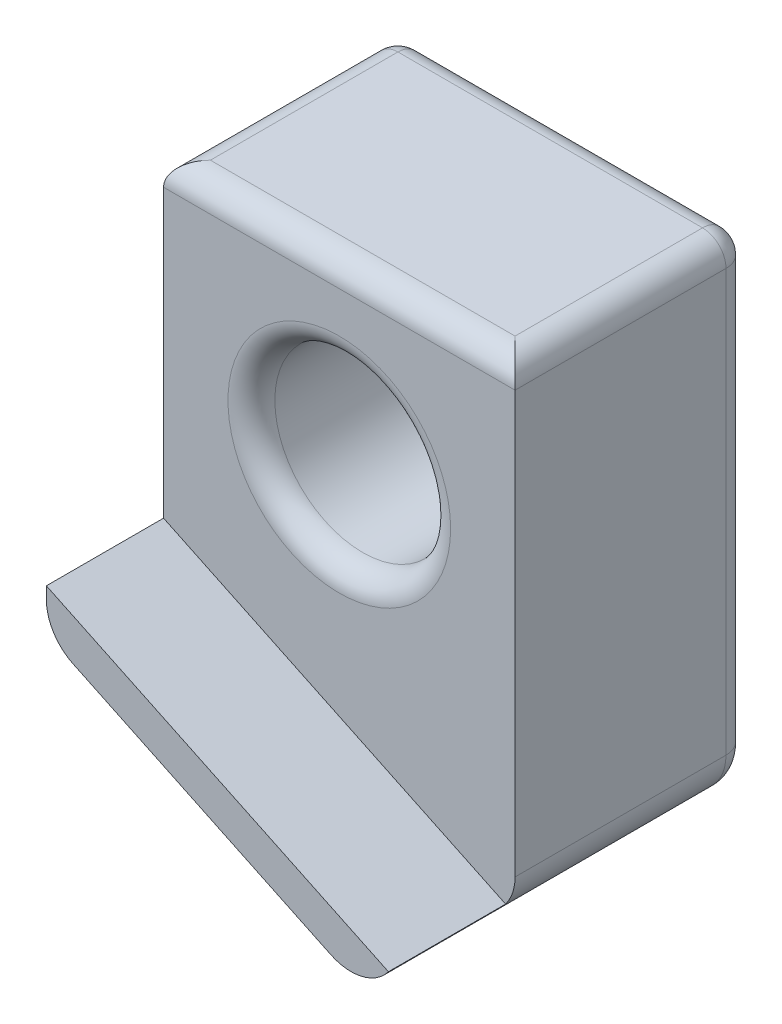
ISO-10303-21;
HEADER;
FILE_DESCRIPTION(('STEP AP214'),'2;1');
FILE_NAME('part.step','',(''),(''),'','','');
FILE_SCHEMA(('AUTOMOTIVE_DESIGN { 1 0 10303 214 1 1 1 1 }'));
ENDSEC;
DATA;
#1=APPLICATION_CONTEXT('core data for automotive mechanical design processes');
#2=APPLICATION_PROTOCOL_DEFINITION('international standard','automotive_design',2000,#1);
#3=PRODUCT_CONTEXT('',#1,'mechanical');
#4=PRODUCT('Part','Part','',(#3));
#5=PRODUCT_RELATED_PRODUCT_CATEGORY('part','',(#4));
#6=PRODUCT_DEFINITION_FORMATION('','',#4);
#7=PRODUCT_DEFINITION_CONTEXT('part definition',#1,'design');
#8=PRODUCT_DEFINITION('design','',#6,#7);
#9=PRODUCT_DEFINITION_SHAPE('','',#8);
#10=(LENGTH_UNIT() NAMED_UNIT(*) SI_UNIT(.MILLI.,.METRE.));
#11=(NAMED_UNIT(*) PLANE_ANGLE_UNIT() SI_UNIT($,.RADIAN.));
#12=(NAMED_UNIT(*) SI_UNIT($,.STERADIAN.) SOLID_ANGLE_UNIT());
#13=UNCERTAINTY_MEASURE_WITH_UNIT(LENGTH_MEASURE(1.E-05),#10,'distance_accuracy_value','');
#14=(GEOMETRIC_REPRESENTATION_CONTEXT(3) GLOBAL_UNCERTAINTY_ASSIGNED_CONTEXT((#13)) GLOBAL_UNIT_ASSIGNED_CONTEXT((#10,
#11,#12)) REPRESENTATION_CONTEXT('',''));
#15=CARTESIAN_POINT('',(0.,0.,0.));
#16=DIRECTION('',(0.,0.,1.));
#17=DIRECTION('',(1.,0.,0.));
#18=AXIS2_PLACEMENT_3D('',#15,#16,#17);
#19=CARTESIAN_POINT('',(0.,0.,10.));
#20=DIRECTION('',(0.,0.,1.));
#21=DIRECTION('',(1.,0.,0.));
#22=AXIS2_PLACEMENT_3D('',#19,#20,#21);
#23=PLANE('',#22);
#24=CARTESIAN_POINT('',(0.,0.,10.));
#25=DIRECTION('',(0.,0.,1.));
#26=DIRECTION('',(1.,0.,0.));
#27=AXIS2_PLACEMENT_3D('',#24,#25,#26);
#28=CIRCLE('',#27,4.75);
#29=CARTESIAN_POINT('',(4.75,0.,10.));
#30=VERTEX_POINT('',#29);
#31=EDGE_CURVE('E214',#30,#30,#28,.F.);
#32=ORIENTED_EDGE('',*,*,#31,.T.);
#33=EDGE_LOOP('',(#32));
#34=FACE_BOUND('',#33,.T.);
#35=DIRECTION('',(0.,1.,0.));
#36=VECTOR('',#35,1.);
#37=CARTESIAN_POINT('',(7.5,7.5,10.));
#38=LINE('',#37,#36);
#39=CARTESIAN_POINT('',(7.5,-11.488406702993,10.));
#40=VERTEX_POINT('',#39);
#41=CARTESIAN_POINT('',(7.5,6.5,10.));
#42=VERTEX_POINT('',#41);
#43=EDGE_CURVE('E163',#40,#42,#38,.T.);
#44=ORIENTED_EDGE('',*,*,#43,.T.);
#45=DIRECTION('',(-1.,0.,0.));
#46=VECTOR('',#45,1.);
#47=CARTESIAN_POINT('',(-7.5,6.5,10.));
#48=LINE('',#47,#46);
#49=CARTESIAN_POINT('',(-7.5,6.5,10.));
#50=VERTEX_POINT('',#49);
#51=EDGE_CURVE('E217',#42,#50,#48,.T.);
#52=ORIENTED_EDGE('',*,*,#51,.T.);
#53=DIRECTION('',(0.,-1.,0.));
#54=VECTOR('',#53,1.);
#55=CARTESIAN_POINT('',(-7.5,0.,10.));
#56=LINE('',#55,#54);
#57=CARTESIAN_POINT('',(-7.5,-5.72858305383451,10.));
#58=VERTEX_POINT('',#57);
#59=EDGE_CURVE('E170',#50,#58,#56,.T.);
#60=ORIENTED_EDGE('',*,*,#59,.T.);
#61=DIRECTION('',(-0.902522036117792,0.430643674424453,0.));
#62=VECTOR('',#61,1.);
#63=CARTESIAN_POINT('',(-7.5,-5.72858305383451,10.));
#64=LINE('',#63,#62);
#65=CARTESIAN_POINT('',(7.09631730631528,-12.6933013280778,10.));
#66=VERTEX_POINT('',#65);
#67=EDGE_CURVE('E146',#66,#58,#64,.T.);
#68=ORIENTED_EDGE('',*,*,#67,.F.);
#69=CARTESIAN_POINT('',(5.5,-11.488406702993,10.));
#70=DIRECTION('',(0.,0.,1.));
#71=DIRECTION('',(1.,0.,0.));
#72=AXIS2_PLACEMENT_3D('',#69,#70,#71);
#73=CIRCLE('',#72,2.);
#74=EDGE_CURVE('E186',#66,#40,#73,.T.);
#75=ORIENTED_EDGE('',*,*,#74,.T.);
#76=EDGE_LOOP('',(#44,#52,#60,#68,#75));
#77=FACE_BOUND('',#76,.T.);
#78=ADVANCED_FACE('F39',(#34,#77),#23,.T.);
#79=CARTESIAN_POINT('',(0.,0.,0.));
#80=DIRECTION('',(0.,0.,1.));
#81=DIRECTION('',(1.,0.,0.));
#82=AXIS2_PLACEMENT_3D('',#79,#80,#81);
#83=PLANE('',#82);
#84=DIRECTION('',(0.,-1.,0.));
#85=VECTOR('',#84,1.);
#86=CARTESIAN_POINT('',(-6.5,0.,0.));
#87=LINE('',#86,#85);
#88=CARTESIAN_POINT('',(-6.5,-6.23969229038362,0.));
#89=VERTEX_POINT('',#88);
#90=CARTESIAN_POINT('',(-6.5,6.5,0.));
#91=VERTEX_POINT('',#90);
#92=EDGE_CURVE('E197',#89,#91,#87,.F.);
#93=ORIENTED_EDGE('',*,*,#92,.T.);
#94=DIRECTION('',(-1.,0.,0.));
#95=VECTOR('',#94,1.);
#96=CARTESIAN_POINT('',(0.,6.5,0.));
#97=LINE('',#96,#95);
#98=CARTESIAN_POINT('',(6.5,6.5,0.));
#99=VERTEX_POINT('',#98);
#100=EDGE_CURVE('E204',#91,#99,#97,.F.);
#101=ORIENTED_EDGE('',*,*,#100,.T.);
#102=DIRECTION('',(0.,1.,0.));
#103=VECTOR('',#102,1.);
#104=CARTESIAN_POINT('',(6.5,0.,0.));
#105=LINE('',#104,#103);
#106=CARTESIAN_POINT('',(6.5,-11.488406702993,0.));
#107=VERTEX_POINT('',#106);
#108=EDGE_CURVE('E201',#99,#107,#105,.F.);
#109=ORIENTED_EDGE('',*,*,#108,.T.);
#110=CARTESIAN_POINT('',(5.5,-11.488406702993,0.));
#111=DIRECTION('',(0.,0.,1.));
#112=DIRECTION('',(1.,0.,0.));
#113=AXIS2_PLACEMENT_3D('',#110,#111,#112);
#114=CIRCLE('',#113,1.);
#115=CARTESIAN_POINT('',(5.06935632557555,-12.3909287391107,0.));
#116=VERTEX_POINT('',#115);
#117=EDGE_CURVE('E199',#107,#116,#114,.F.);
#118=ORIENTED_EDGE('',*,*,#117,.T.);
#119=DIRECTION('',(-0.902522036117792,0.430643674424453,0.));
#120=VECTOR('',#119,1.);
#121=CARTESIAN_POINT('',(-5.93064367442445,-7.14221432650141,0.));
#122=LINE('',#121,#120);
#123=CARTESIAN_POINT('',(-5.93064367442445,-7.14221432650141,0.));
#124=VERTEX_POINT('',#123);
#125=EDGE_CURVE('E193',#116,#124,#122,.T.);
#126=ORIENTED_EDGE('',*,*,#125,.T.);
#127=CARTESIAN_POINT('',(-5.5,-6.23969229038362,0.));
#128=DIRECTION('',(0.,0.,1.));
#129=DIRECTION('',(1.,0.,0.));
#130=AXIS2_PLACEMENT_3D('',#127,#128,#129);
#131=CIRCLE('',#130,1.);
#132=EDGE_CURVE('E195',#124,#89,#131,.F.);
#133=ORIENTED_EDGE('',*,*,#132,.T.);
#134=EDGE_LOOP('',(#93,#101,#109,#118,#126,#133));
#135=FACE_BOUND('',#134,.T.);
#136=CARTESIAN_POINT('',(0.,0.,0.));
#137=DIRECTION('',(0.,0.,1.));
#138=DIRECTION('',(1.,0.,0.));
#139=AXIS2_PLACEMENT_3D('',#136,#137,#138);
#140=CIRCLE('',#139,3.75);
#141=CARTESIAN_POINT('',(3.75,0.,0.));
#142=VERTEX_POINT('',#141);
#143=EDGE_CURVE('E160',#142,#142,#140,.T.);
#144=ORIENTED_EDGE('',*,*,#143,.T.);
#145=EDGE_LOOP('',(#144));
#146=FACE_BOUND('',#145,.T.);
#147=ADVANCED_FACE('F273',(#135,#146),#83,.F.);
#148=CARTESIAN_POINT('',(7.5,7.5,10.));
#149=DIRECTION('',(-1.,0.,0.));
#150=DIRECTION('',(0.,0.,1.));
#151=AXIS2_PLACEMENT_3D('',#148,#149,#150);
#152=PLANE('',#151);
#153=DIRECTION('',(0.,0.,-1.));
#154=VECTOR('',#153,1.);
#155=CARTESIAN_POINT('',(7.5,-11.488406702993,0.));
#156=LINE('',#155,#154);
#157=CARTESIAN_POINT('',(7.5,-11.488406702993,0.999999999999999));
#158=VERTEX_POINT('',#157);
#159=EDGE_CURVE('E181',#40,#158,#156,.T.);
#160=ORIENTED_EDGE('',*,*,#159,.T.);
#161=DIRECTION('',(0.,1.,0.));
#162=VECTOR('',#161,1.);
#163=CARTESIAN_POINT('',(7.5,7.5,0.999999999999999));
#164=LINE('',#163,#162);
#165=CARTESIAN_POINT('',(7.5,6.5,0.999999999999999));
#166=VERTEX_POINT('',#165);
#167=EDGE_CURVE('E190',#158,#166,#164,.T.);
#168=ORIENTED_EDGE('',*,*,#167,.T.);
#169=DIRECTION('',(0.,0.,-1.));
#170=VECTOR('',#169,1.);
#171=CARTESIAN_POINT('',(7.5,6.5,10.));
#172=LINE('',#171,#170);
#173=EDGE_CURVE('E188',#166,#42,#172,.F.);
#174=ORIENTED_EDGE('',*,*,#173,.T.);
#175=ORIENTED_EDGE('',*,*,#43,.F.);
#176=EDGE_LOOP('',(#160,#168,#174,#175));
#177=FACE_BOUND('',#176,.T.);
#178=ADVANCED_FACE('F295',(#177),#152,.F.);
#179=CARTESIAN_POINT('',(-7.5,7.5,10.));
#180=DIRECTION('',(0.,-1.,0.));
#181=DIRECTION('',(0.,0.,-1.));
#182=AXIS2_PLACEMENT_3D('',#179,#180,#181);
#183=PLANE('',#182);
#184=DIRECTION('',(-1.,0.,0.));
#185=VECTOR('',#184,1.);
#186=CARTESIAN_POINT('',(-7.5,7.5,0.999999999999999));
#187=LINE('',#186,#185);
#188=CARTESIAN_POINT('',(6.5,7.5,0.999999999999999));
#189=VERTEX_POINT('',#188);
#190=CARTESIAN_POINT('',(-6.5,7.5,0.999999999999999));
#191=VERTEX_POINT('',#190);
#192=EDGE_CURVE('E61',#189,#191,#187,.T.);
#193=ORIENTED_EDGE('',*,*,#192,.T.);
#194=DIRECTION('',(0.,0.,-1.));
#195=VECTOR('',#194,1.);
#196=CARTESIAN_POINT('',(-6.5,7.5,10.));
#197=LINE('',#196,#195);
#198=CARTESIAN_POINT('',(-6.5,7.5,9.));
#199=VERTEX_POINT('',#198);
#200=EDGE_CURVE('E56',#191,#199,#197,.F.);
#201=ORIENTED_EDGE('',*,*,#200,.T.);
#202=DIRECTION('',(-1.,0.,0.));
#203=VECTOR('',#202,1.);
#204=CARTESIAN_POINT('',(7.5,7.5,9.));
#205=LINE('',#204,#203);
#206=CARTESIAN_POINT('',(6.5,7.5,9.));
#207=VERTEX_POINT('',#206);
#208=EDGE_CURVE('E222',#199,#207,#205,.F.);
#209=ORIENTED_EDGE('',*,*,#208,.T.);
#210=DIRECTION('',(0.,0.,-1.));
#211=VECTOR('',#210,1.);
#212=CARTESIAN_POINT('',(6.5,7.5,10.));
#213=LINE('',#212,#211);
#214=EDGE_CURVE('E219',#207,#189,#213,.T.);
#215=ORIENTED_EDGE('',*,*,#214,.T.);
#216=EDGE_LOOP('',(#193,#201,#209,#215));
#217=FACE_BOUND('',#216,.T.);
#218=ADVANCED_FACE('F303',(#217),#183,.F.);
#219=CARTESIAN_POINT('',(-7.5,0.,10.));
#220=DIRECTION('',(1.,0.,0.));
#221=DIRECTION('',(0.,0.,-1.));
#222=AXIS2_PLACEMENT_3D('',#219,#220,#221);
#223=PLANE('',#222);
#224=DIRECTION('',(0.,0.,-1.));
#225=VECTOR('',#224,1.);
#226=CARTESIAN_POINT('',(-7.5,6.5,10.));
#227=LINE('',#226,#225);
#228=CARTESIAN_POINT('',(-7.5,6.5,0.999999999999999));
#229=VERTEX_POINT('',#228);
#230=EDGE_CURVE('E208',#50,#229,#227,.T.);
#231=ORIENTED_EDGE('',*,*,#230,.T.);
#232=DIRECTION('',(0.,-1.,0.));
#233=VECTOR('',#232,1.);
#234=CARTESIAN_POINT('',(-7.5,0.,0.999999999999999));
#235=LINE('',#234,#233);
#236=CARTESIAN_POINT('',(-7.5,-6.23969229038362,0.999999999999999));
#237=VERTEX_POINT('',#236);
#238=EDGE_CURVE('E210',#229,#237,#235,.T.);
#239=ORIENTED_EDGE('',*,*,#238,.T.);
#240=DIRECTION('',(0.,0.,-1.));
#241=VECTOR('',#240,1.);
#242=CARTESIAN_POINT('',(-7.5,-6.23969229038362,15.));
#243=LINE('',#242,#241);
#244=CARTESIAN_POINT('',(-7.5,-6.23969229038362,15.));
#245=VERTEX_POINT('',#244);
#246=EDGE_CURVE('E154',#237,#245,#243,.F.);
#247=ORIENTED_EDGE('',*,*,#246,.T.);
#248=DIRECTION('',(0.,-1.,0.));
#249=VECTOR('',#248,1.);
#250=CARTESIAN_POINT('',(-7.5,-7.50139295317218,15.));
#251=LINE('',#250,#249);
#252=CARTESIAN_POINT('',(-7.5,-5.72858305383451,15.));
#253=VERTEX_POINT('',#252);
#254=EDGE_CURVE('E138',#253,#245,#251,.T.);
#255=ORIENTED_EDGE('',*,*,#254,.F.);
#256=DIRECTION('',(0.,0.,-1.));
#257=VECTOR('',#256,1.);
#258=CARTESIAN_POINT('',(-7.5,-5.72858305383451,15.));
#259=LINE('',#258,#257);
#260=EDGE_CURVE('E152',#253,#58,#259,.T.);
#261=ORIENTED_EDGE('',*,*,#260,.T.);
#262=ORIENTED_EDGE('',*,*,#59,.F.);
#263=EDGE_LOOP('',(#231,#239,#247,#255,#261,#262));
#264=FACE_BOUND('',#263,.T.);
#265=ADVANCED_FACE('F150',(#264),#223,.F.);
#266=CARTESIAN_POINT('',(0.,0.,10.));
#267=DIRECTION('',(0.,0.,-1.));
#268=DIRECTION('',(-1.,0.,0.));
#269=AXIS2_PLACEMENT_3D('',#266,#267,#268);
#270=CYLINDRICAL_SURFACE('',#269,3.75);
#271=CARTESIAN_POINT('',(0.,0.,9.));
#272=DIRECTION('',(0.,0.,1.));
#273=DIRECTION('',(1.,0.,0.));
#274=AXIS2_PLACEMENT_3D('',#271,#272,#273);
#275=CIRCLE('',#274,3.75);
#276=CARTESIAN_POINT('',(3.75,0.,9.));
#277=VERTEX_POINT('',#276);
#278=EDGE_CURVE('E11',#277,#277,#275,.T.);
#279=ORIENTED_EDGE('',*,*,#278,.T.);
#280=EDGE_LOOP('',(#279));
#281=FACE_BOUND('',#280,.T.);
#282=ORIENTED_EDGE('',*,*,#143,.F.);
#283=EDGE_LOOP('',(#282));
#284=FACE_BOUND('',#283,.T.);
#285=ADVANCED_FACE('F319',(#281,#284),#270,.F.);
#286=CARTESIAN_POINT('',(7.5,-14.6587307885485,10.));
#287=DIRECTION('',(-0.430643674424453,-0.902522036117793,0.));
#288=DIRECTION('',(0.902522036117792,-0.430643674424453,0.));
#289=AXIS2_PLACEMENT_3D('',#286,#287,#288);
#290=PLANE('',#289);
#291=DIRECTION('',(0.,0.,-1.));
#292=VECTOR('',#291,1.);
#293=CARTESIAN_POINT('',(-6.36128734884891,-8.0447363626192,0.));
#294=LINE('',#293,#292);
#295=CARTESIAN_POINT('',(-6.36128734884891,-8.0447363626192,15.));
#296=VERTEX_POINT('',#295);
#297=CARTESIAN_POINT('',(-6.36128734884891,-8.0447363626192,1.));
#298=VERTEX_POINT('',#297);
#299=EDGE_CURVE('E174',#296,#298,#294,.T.);
#300=ORIENTED_EDGE('',*,*,#299,.T.);
#301=DIRECTION('',(-0.902522036117792,0.430643674424453,0.));
#302=VECTOR('',#301,1.);
#303=CARTESIAN_POINT('',(4.63871265115109,-13.2934507752285,1.));
#304=LINE('',#303,#302);
#305=CARTESIAN_POINT('',(4.63871265115109,-13.2934507752285,1.));
#306=VERTEX_POINT('',#305);
#307=EDGE_CURVE('E48',#298,#306,#304,.F.);
#308=ORIENTED_EDGE('',*,*,#307,.T.);
#309=DIRECTION('',(0.,0.,-1.));
#310=VECTOR('',#309,1.);
#311=CARTESIAN_POINT('',(4.63871265115109,-13.2934507752285,15.));
#312=LINE('',#311,#310);
#313=CARTESIAN_POINT('',(4.63871265115109,-13.2934507752285,15.));
#314=VERTEX_POINT('',#313);
#315=EDGE_CURVE('E172',#306,#314,#312,.F.);
#316=ORIENTED_EDGE('',*,*,#315,.T.);
#317=DIRECTION('',(0.902522036117793,-0.430643674424453,0.));
#318=VECTOR('',#317,1.);
#319=CARTESIAN_POINT('',(7.5,-14.6587307885485,15.));
#320=LINE('',#319,#318);
#321=EDGE_CURVE('E155',#296,#314,#320,.T.);
#322=ORIENTED_EDGE('',*,*,#321,.F.);
#323=EDGE_LOOP('',(#300,#308,#316,#322));
#324=FACE_BOUND('',#323,.T.);
#325=ADVANCED_FACE('F317',(#324),#290,.T.);
#326=CARTESIAN_POINT('',(-7.5,-5.72858305383451,15.));
#327=DIRECTION('',(-0.430643674424453,-0.902522036117792,0.));
#328=DIRECTION('',(0.902522036117793,-0.430643674424453,0.));
#329=AXIS2_PLACEMENT_3D('',#326,#327,#328);
#330=PLANE('',#329);
#331=DIRECTION('',(-0.902522036117792,0.430643674424453,0.));
#332=VECTOR('',#331,1.);
#333=CARTESIAN_POINT('',(-7.5,-5.72858305383451,15.));
#334=LINE('',#333,#332);
#335=CARTESIAN_POINT('',(7.09631730631527,-12.6933013280778,15.));
#336=VERTEX_POINT('',#335);
#337=EDGE_CURVE('E135',#336,#253,#334,.T.);
#338=ORIENTED_EDGE('',*,*,#337,.F.);
#339=DIRECTION('',(0.,0.,1.));
#340=VECTOR('',#339,1.);
#341=CARTESIAN_POINT('',(7.09631730631528,-12.6933013280778,15.));
#342=LINE('',#341,#340);
#343=EDGE_CURVE('E184',#336,#66,#342,.F.);
#344=ORIENTED_EDGE('',*,*,#343,.T.);
#345=ORIENTED_EDGE('',*,*,#67,.T.);
#346=ORIENTED_EDGE('',*,*,#260,.F.);
#347=EDGE_LOOP('',(#338,#344,#345,#346));
#348=FACE_BOUND('',#347,.T.);
#349=ADVANCED_FACE('F158',(#348),#330,.F.);
#350=CARTESIAN_POINT('',(0.,0.,15.));
#351=DIRECTION('',(0.,0.,-1.));
#352=DIRECTION('',(-1.,0.,0.));
#353=AXIS2_PLACEMENT_3D('',#350,#351,#352);
#354=PLANE('',#353);
#355=ORIENTED_EDGE('',*,*,#254,.T.);
#356=CARTESIAN_POINT('',(-5.5,-6.23969229038362,15.));
#357=DIRECTION('',(0.,0.,-1.));
#358=DIRECTION('',(-1.,0.,0.));
#359=AXIS2_PLACEMENT_3D('',#356,#357,#358);
#360=CIRCLE('',#359,2.);
#361=EDGE_CURVE('E179',#245,#296,#360,.F.);
#362=ORIENTED_EDGE('',*,*,#361,.T.);
#363=ORIENTED_EDGE('',*,*,#321,.T.);
#364=CARTESIAN_POINT('',(5.5,-11.488406702993,15.));
#365=DIRECTION('',(0.,0.,-1.));
#366=DIRECTION('',(-1.,0.,0.));
#367=AXIS2_PLACEMENT_3D('',#364,#365,#366);
#368=CIRCLE('',#367,2.);
#369=EDGE_CURVE('E142',#314,#336,#368,.F.);
#370=ORIENTED_EDGE('',*,*,#369,.T.);
#371=ORIENTED_EDGE('',*,*,#337,.T.);
#372=EDGE_LOOP('',(#355,#362,#363,#370,#371));
#373=FACE_BOUND('',#372,.T.);
#374=ADVANCED_FACE('F137',(#373),#354,.F.);
#375=CARTESIAN_POINT('',(-5.5,-6.23969229038362,10.));
#376=DIRECTION('',(0.,0.,1.));
#377=DIRECTION('',(1.,0.,0.));
#378=AXIS2_PLACEMENT_3D('',#375,#376,#377);
#379=CYLINDRICAL_SURFACE('',#378,2.);
#380=ORIENTED_EDGE('',*,*,#246,.F.);
#381=CARTESIAN_POINT('',(-5.5,-6.23969229038362,0.999999999999999));
#382=DIRECTION('',(0.,0.,1.));
#383=DIRECTION('',(1.,0.,0.));
#384=AXIS2_PLACEMENT_3D('',#381,#382,#383);
#385=CIRCLE('',#384,2.);
#386=EDGE_CURVE('E212',#237,#298,#385,.T.);
#387=ORIENTED_EDGE('',*,*,#386,.T.);
#388=ORIENTED_EDGE('',*,*,#299,.F.);
#389=ORIENTED_EDGE('',*,*,#361,.F.);
#390=EDGE_LOOP('',(#380,#387,#388,#389));
#391=FACE_BOUND('',#390,.T.);
#392=ADVANCED_FACE('F313',(#391),#379,.T.);
#393=CARTESIAN_POINT('',(5.5,-11.488406702993,10.));
#394=DIRECTION('',(0.,0.,1.));
#395=DIRECTION('',(1.,0.,0.));
#396=AXIS2_PLACEMENT_3D('',#393,#394,#395);
#397=CYLINDRICAL_SURFACE('',#396,2.);
#398=ORIENTED_EDGE('',*,*,#315,.F.);
#399=CARTESIAN_POINT('',(5.5,-11.488406702993,0.999999999999999));
#400=DIRECTION('',(0.,0.,1.));
#401=DIRECTION('',(1.,0.,0.));
#402=AXIS2_PLACEMENT_3D('',#399,#400,#401);
#403=CIRCLE('',#402,2.);
#404=EDGE_CURVE('E206',#306,#158,#403,.T.);
#405=ORIENTED_EDGE('',*,*,#404,.T.);
#406=ORIENTED_EDGE('',*,*,#159,.F.);
#407=ORIENTED_EDGE('',*,*,#74,.F.);
#408=ORIENTED_EDGE('',*,*,#343,.F.);
#409=ORIENTED_EDGE('',*,*,#369,.F.);
#410=EDGE_LOOP('',(#398,#405,#406,#407,#408,#409));
#411=FACE_BOUND('',#410,.T.);
#412=ADVANCED_FACE('F291',(#411),#397,.T.);
#413=CARTESIAN_POINT('',(-6.5,6.5,10.));
#414=DIRECTION('',(0.,0.,-1.));
#415=DIRECTION('',(-1.,0.,0.));
#416=AXIS2_PLACEMENT_3D('',#413,#414,#415);
#417=CYLINDRICAL_SURFACE('',#416,1.);
#418=CARTESIAN_POINT('',(-6.5,6.5,0.999999999999999));
#419=DIRECTION('',(0.,0.,-1.));
#420=DIRECTION('',(-1.,0.,0.));
#421=AXIS2_PLACEMENT_3D('',#418,#419,#420);
#422=CIRCLE('',#421,1.);
#423=EDGE_CURVE('E251',#229,#191,#422,.T.);
#424=ORIENTED_EDGE('',*,*,#423,.F.);
#425=ORIENTED_EDGE('',*,*,#230,.F.);
#426=CARTESIAN_POINT('',(-6.5,6.5,9.));
#427=DIRECTION('',(-0.707106781186547,0.,-0.707106781186547));
#428=DIRECTION('',(0.707106781186547,0.,-0.707106781186547));
#429=AXIS2_PLACEMENT_3D('',#426,#427,#428);
#430=ELLIPSE('',#429,1.41421356237309,1.);
#431=EDGE_CURVE('E253',#199,#50,#430,.F.);
#432=ORIENTED_EDGE('',*,*,#431,.F.);
#433=ORIENTED_EDGE('',*,*,#200,.F.);
#434=EDGE_LOOP('',(#424,#425,#432,#433));
#435=FACE_BOUND('',#434,.T.);
#436=ADVANCED_FACE('F311',(#435),#417,.T.);
#437=CARTESIAN_POINT('',(-6.5,0.,0.999999999999999));
#438=DIRECTION('',(0.,-1.,0.));
#439=DIRECTION('',(0.,0.,-1.));
#440=AXIS2_PLACEMENT_3D('',#437,#438,#439);
#441=CYLINDRICAL_SURFACE('',#440,1.);
#442=CARTESIAN_POINT('',(-6.5,6.5,1.));
#443=DIRECTION('',(0.,1.,0.));
#444=DIRECTION('',(0.,0.,1.));
#445=AXIS2_PLACEMENT_3D('',#442,#443,#444);
#446=CIRCLE('',#445,1.);
#447=EDGE_CURVE('E248',#91,#229,#446,.T.);
#448=ORIENTED_EDGE('',*,*,#447,.F.);
#449=ORIENTED_EDGE('',*,*,#92,.F.);
#450=CARTESIAN_POINT('',(-6.5,-6.23969229038362,0.999999999999999));
#451=DIRECTION('',(0.,-1.,0.));
#452=DIRECTION('',(0.,0.,-1.));
#453=AXIS2_PLACEMENT_3D('',#450,#451,#452);
#454=CIRCLE('',#453,1.);
#455=EDGE_CURVE('E43',#237,#89,#454,.T.);
#456=ORIENTED_EDGE('',*,*,#455,.F.);
#457=ORIENTED_EDGE('',*,*,#238,.F.);
#458=EDGE_LOOP('',(#448,#449,#456,#457));
#459=FACE_BOUND('',#458,.T.);
#460=ADVANCED_FACE('F269',(#459),#441,.T.);
#461=CARTESIAN_POINT('',(-5.5,-6.23969229038362,0.999999999999999));
#462=DIRECTION('',(0.,0.,1.));
#463=DIRECTION('',(1.,0.,0.));
#464=AXIS2_PLACEMENT_3D('',#461,#462,#463);
#465=DEGENERATE_TOROIDAL_SURFACE('',#464,1.,1.,.T.);
#466=ORIENTED_EDGE('',*,*,#455,.T.);
#467=ORIENTED_EDGE('',*,*,#132,.F.);
#468=CARTESIAN_POINT('',(-5.93064367442445,-7.14221432650141,0.999999999999999));
#469=DIRECTION('',(0.902522036117793,-0.430643674424453,0.));
#470=DIRECTION('',(0.430643674424453,0.902522036117793,0.));
#471=AXIS2_PLACEMENT_3D('',#468,#469,#470);
#472=CIRCLE('',#471,1.);
#473=EDGE_CURVE('E245',#298,#124,#472,.T.);
#474=ORIENTED_EDGE('',*,*,#473,.F.);
#475=ORIENTED_EDGE('',*,*,#386,.F.);
#476=EDGE_LOOP('',(#466,#467,#474,#475));
#477=FACE_BOUND('',#476,.T.);
#478=ADVANCED_FACE('F263',(#477),#465,.T.);
#479=CARTESIAN_POINT('',(0.,6.5,9.));
#480=DIRECTION('',(1.,0.,0.));
#481=DIRECTION('',(0.,0.,-1.));
#482=AXIS2_PLACEMENT_3D('',#479,#480,#481);
#483=CYLINDRICAL_SURFACE('',#482,1.);
#484=ORIENTED_EDGE('',*,*,#431,.T.);
#485=ORIENTED_EDGE('',*,*,#51,.F.);
#486=CARTESIAN_POINT('',(6.5,6.5,9.));
#487=DIRECTION('',(0.707106781186547,0.,-0.707106781186547));
#488=DIRECTION('',(-0.707106781186547,0.,-0.707106781186547));
#489=AXIS2_PLACEMENT_3D('',#486,#487,#488);
#490=ELLIPSE('',#489,1.41421356237309,1.);
#491=EDGE_CURVE('E242',#207,#42,#490,.T.);
#492=ORIENTED_EDGE('',*,*,#491,.F.);
#493=ORIENTED_EDGE('',*,*,#208,.F.);
#494=EDGE_LOOP('',(#484,#485,#492,#493));
#495=FACE_BOUND('',#494,.T.);
#496=ADVANCED_FACE('F299',(#495),#483,.T.);
#497=CARTESIAN_POINT('',(-6.5,6.5,1.));
#498=DIRECTION('',(-1.,0.,0.));
#499=DIRECTION('',(0.,0.,1.));
#500=AXIS2_PLACEMENT_3D('',#497,#498,#499);
#501=SPHERICAL_SURFACE('',#500,1.);
#502=ORIENTED_EDGE('',*,*,#447,.T.);
#503=ORIENTED_EDGE('',*,*,#423,.T.);
#504=CARTESIAN_POINT('',(-6.5,6.5,0.999999999999999));
#505=DIRECTION('',(-1.,0.,0.));
#506=DIRECTION('',(0.,0.,1.));
#507=AXIS2_PLACEMENT_3D('',#504,#505,#506);
#508=CIRCLE('',#507,1.);
#509=EDGE_CURVE('E239',#91,#191,#508,.F.);
#510=ORIENTED_EDGE('',*,*,#509,.F.);
#511=EDGE_LOOP('',(#502,#503,#510));
#512=FACE_BOUND('',#511,.T.);
#513=ADVANCED_FACE('F308',(#512),#501,.T.);
#514=CARTESIAN_POINT('',(-3.87579306982008,-8.12269832506014,1.));
#515=DIRECTION('',(0.902522036117792,-0.430643674424453,0.));
#516=DIRECTION('',(0.430643674424453,0.902522036117793,0.));
#517=AXIS2_PLACEMENT_3D('',#514,#515,#516);
#518=CYLINDRICAL_SURFACE('',#517,1.);
#519=ORIENTED_EDGE('',*,*,#473,.T.);
#520=ORIENTED_EDGE('',*,*,#125,.F.);
#521=CARTESIAN_POINT('',(5.06935632557555,-12.3909287391107,1.));
#522=DIRECTION('',(0.902522036117793,-0.430643674424453,0.));
#523=DIRECTION('',(0.430643674424453,0.902522036117793,0.));
#524=AXIS2_PLACEMENT_3D('',#521,#522,#523);
#525=CIRCLE('',#524,1.);
#526=EDGE_CURVE('E236',#306,#116,#525,.T.);
#527=ORIENTED_EDGE('',*,*,#526,.F.);
#528=ORIENTED_EDGE('',*,*,#307,.F.);
#529=EDGE_LOOP('',(#519,#520,#527,#528));
#530=FACE_BOUND('',#529,.T.);
#531=ADVANCED_FACE('F281',(#530),#518,.T.);
#532=CARTESIAN_POINT('',(6.5,6.5,10.));
#533=DIRECTION('',(0.,0.,-1.));
#534=DIRECTION('',(-1.,0.,0.));
#535=AXIS2_PLACEMENT_3D('',#532,#533,#534);
#536=CYLINDRICAL_SURFACE('',#535,1.);
#537=ORIENTED_EDGE('',*,*,#491,.T.);
#538=ORIENTED_EDGE('',*,*,#173,.F.);
#539=CARTESIAN_POINT('',(6.5,6.5,0.999999999999999));
#540=DIRECTION('',(0.,0.,-1.));
#541=DIRECTION('',(-1.,0.,0.));
#542=AXIS2_PLACEMENT_3D('',#539,#540,#541);
#543=CIRCLE('',#542,1.);
#544=EDGE_CURVE('E233',#189,#166,#543,.T.);
#545=ORIENTED_EDGE('',*,*,#544,.F.);
#546=ORIENTED_EDGE('',*,*,#214,.F.);
#547=EDGE_LOOP('',(#537,#538,#545,#546));
#548=FACE_BOUND('',#547,.T.);
#549=ADVANCED_FACE('F301',(#548),#536,.T.);
#550=CARTESIAN_POINT('',(-7.5,6.5,0.999999999999999));
#551=DIRECTION('',(-1.,0.,0.));
#552=DIRECTION('',(0.,0.,1.));
#553=AXIS2_PLACEMENT_3D('',#550,#551,#552);
#554=CYLINDRICAL_SURFACE('',#553,1.);
#555=ORIENTED_EDGE('',*,*,#509,.T.);
#556=ORIENTED_EDGE('',*,*,#192,.F.);
#557=CARTESIAN_POINT('',(6.5,6.5,1.));
#558=DIRECTION('',(1.,0.,0.));
#559=DIRECTION('',(0.,1.,0.));
#560=AXIS2_PLACEMENT_3D('',#557,#558,#559);
#561=CIRCLE('',#560,1.);
#562=EDGE_CURVE('E230',#99,#189,#561,.T.);
#563=ORIENTED_EDGE('',*,*,#562,.F.);
#564=ORIENTED_EDGE('',*,*,#100,.F.);
#565=EDGE_LOOP('',(#555,#556,#563,#564));
#566=FACE_BOUND('',#565,.T.);
#567=ADVANCED_FACE('F305',(#566),#554,.T.);
#568=CARTESIAN_POINT('',(5.5,-11.488406702993,0.999999999999999));
#569=DIRECTION('',(0.,0.,1.));
#570=DIRECTION('',(1.,0.,0.));
#571=AXIS2_PLACEMENT_3D('',#568,#569,#570);
#572=DEGENERATE_TOROIDAL_SURFACE('',#571,1.,1.,.T.);
#573=ORIENTED_EDGE('',*,*,#526,.T.);
#574=ORIENTED_EDGE('',*,*,#117,.F.);
#575=CARTESIAN_POINT('',(6.5,-11.488406702993,0.999999999999999));
#576=DIRECTION('',(0.,1.,0.));
#577=DIRECTION('',(0.,0.,1.));
#578=AXIS2_PLACEMENT_3D('',#575,#576,#577);
#579=CIRCLE('',#578,1.);
#580=EDGE_CURVE('E228',#158,#107,#579,.T.);
#581=ORIENTED_EDGE('',*,*,#580,.F.);
#582=ORIENTED_EDGE('',*,*,#404,.F.);
#583=EDGE_LOOP('',(#573,#574,#581,#582));
#584=FACE_BOUND('',#583,.T.);
#585=ADVANCED_FACE('F285',(#584),#572,.T.);
#586=CARTESIAN_POINT('',(6.5,6.5,1.));
#587=DIRECTION('',(0.,1.,0.));
#588=DIRECTION('',(0.,0.,1.));
#589=AXIS2_PLACEMENT_3D('',#586,#587,#588);
#590=SPHERICAL_SURFACE('',#589,1.);
#591=ORIENTED_EDGE('',*,*,#562,.T.);
#592=ORIENTED_EDGE('',*,*,#544,.T.);
#593=CARTESIAN_POINT('',(6.5,6.5,0.999999999999999));
#594=DIRECTION('',(0.,1.,0.));
#595=DIRECTION('',(0.,0.,1.));
#596=AXIS2_PLACEMENT_3D('',#593,#594,#595);
#597=CIRCLE('',#596,1.);
#598=EDGE_CURVE('E226',#99,#166,#597,.F.);
#599=ORIENTED_EDGE('',*,*,#598,.F.);
#600=EDGE_LOOP('',(#591,#592,#599));
#601=FACE_BOUND('',#600,.T.);
#602=ADVANCED_FACE('F349',(#601),#590,.T.);
#603=CARTESIAN_POINT('',(6.5,7.5,0.999999999999999));
#604=DIRECTION('',(0.,1.,0.));
#605=DIRECTION('',(0.,0.,1.));
#606=AXIS2_PLACEMENT_3D('',#603,#604,#605);
#607=CYLINDRICAL_SURFACE('',#606,1.);
#608=ORIENTED_EDGE('',*,*,#580,.T.);
#609=ORIENTED_EDGE('',*,*,#108,.F.);
#610=ORIENTED_EDGE('',*,*,#598,.T.);
#611=ORIENTED_EDGE('',*,*,#167,.F.);
#612=EDGE_LOOP('',(#608,#609,#610,#611));
#613=FACE_BOUND('',#612,.T.);
#614=ADVANCED_FACE('F346',(#613),#607,.T.);
#615=CARTESIAN_POINT('',(0.,0.,9.));
#616=DIRECTION('',(0.,0.,1.));
#617=DIRECTION('',(1.,0.,0.));
#618=AXIS2_PLACEMENT_3D('',#615,#616,#617);
#619=TOROIDAL_SURFACE('',#618,4.75,1.);
#620=ORIENTED_EDGE('',*,*,#31,.F.);
#621=EDGE_LOOP('',(#620));
#622=FACE_BOUND('',#621,.T.);
#623=ORIENTED_EDGE('',*,*,#278,.F.);
#624=EDGE_LOOP('',(#623));
#625=FACE_BOUND('',#624,.T.);
#626=ADVANCED_FACE('F41',(#622,#625),#619,.T.);
#627=CLOSED_SHELL('',(#78,#147,#178,#218,#265,#285,#325,#349,#374,#392,#412,#436,#460,#478,#496,
#513,#531,#549,#567,#585,#602,#614,#626));
#628=MANIFOLD_SOLID_BREP('B2',#627);
#629=ADVANCED_BREP_SHAPE_REPRESENTATION('',(#18,#628),#14);
#630=SHAPE_DEFINITION_REPRESENTATION(#9,#629);
ENDSEC;
END-ISO-10303-21;
